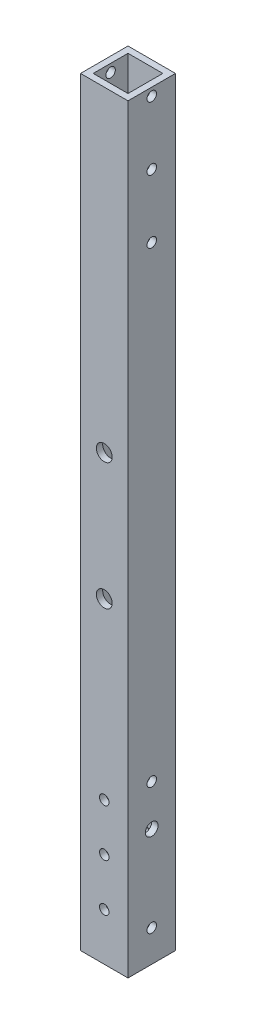
ISO-10303-21;
HEADER;
FILE_DESCRIPTION(('STEP AP214'),'2;1');
FILE_NAME('part.step','',(''),(''),'','','');
FILE_SCHEMA(('AUTOMOTIVE_DESIGN { 1 0 10303 214 1 1 1 1 }'));
ENDSEC;
DATA;
#1=APPLICATION_CONTEXT('core data for automotive mechanical design processes');
#2=APPLICATION_PROTOCOL_DEFINITION('international standard','automotive_design',2000,#1);
#3=PRODUCT_CONTEXT('',#1,'mechanical');
#4=PRODUCT('Part','Part','',(#3));
#5=PRODUCT_RELATED_PRODUCT_CATEGORY('part','',(#4));
#6=PRODUCT_DEFINITION_FORMATION('','',#4);
#7=PRODUCT_DEFINITION_CONTEXT('part definition',#1,'design');
#8=PRODUCT_DEFINITION('design','',#6,#7);
#9=PRODUCT_DEFINITION_SHAPE('','',#8);
#10=(LENGTH_UNIT() NAMED_UNIT(*) SI_UNIT(.MILLI.,.METRE.));
#11=(NAMED_UNIT(*) PLANE_ANGLE_UNIT() SI_UNIT($,.RADIAN.));
#12=(NAMED_UNIT(*) SI_UNIT($,.STERADIAN.) SOLID_ANGLE_UNIT());
#13=UNCERTAINTY_MEASURE_WITH_UNIT(LENGTH_MEASURE(1.E-05),#10,'distance_accuracy_value','');
#14=(GEOMETRIC_REPRESENTATION_CONTEXT(3) GLOBAL_UNCERTAINTY_ASSIGNED_CONTEXT((#13)) GLOBAL_UNIT_ASSIGNED_CONTEXT((#10,
#11,#12)) REPRESENTATION_CONTEXT('',''));
#15=CARTESIAN_POINT('',(0.,0.,0.));
#16=DIRECTION('',(0.,0.,1.));
#17=DIRECTION('',(1.,0.,0.));
#18=AXIS2_PLACEMENT_3D('',#15,#16,#17);
#19=CARTESIAN_POINT('',(7.49999999999999,240.,-7.5));
#20=DIRECTION('',(-1.,0.,0.));
#21=DIRECTION('',(0.,0.,1.));
#22=AXIS2_PLACEMENT_3D('',#19,#20,#21);
#23=PLANE('',#22);
#24=CARTESIAN_POINT('',(7.49999999999999,10.,0.));
#25=DIRECTION('',(-1.,0.,0.));
#26=DIRECTION('',(0.,0.,1.));
#27=AXIS2_PLACEMENT_3D('',#24,#25,#26);
#28=CIRCLE('',#27,1.5);
#29=CARTESIAN_POINT('',(7.49999999999999,10.,1.5));
#30=VERTEX_POINT('',#29);
#31=EDGE_CURVE('E195',#30,#30,#28,.T.);
#32=ORIENTED_EDGE('',*,*,#31,.T.);
#33=EDGE_LOOP('',(#32));
#34=FACE_BOUND('',#33,.T.);
#35=CARTESIAN_POINT('',(7.49999999999999,197.5,0.));
#36=DIRECTION('',(-1.,0.,0.));
#37=DIRECTION('',(0.,0.,1.));
#38=AXIS2_PLACEMENT_3D('',#35,#36,#37);
#39=CIRCLE('',#38,1.5);
#40=CARTESIAN_POINT('',(7.49999999999999,197.5,1.5));
#41=VERTEX_POINT('',#40);
#42=EDGE_CURVE('E297',#41,#41,#39,.T.);
#43=ORIENTED_EDGE('',*,*,#42,.T.);
#44=EDGE_LOOP('',(#43));
#45=FACE_BOUND('',#44,.T.);
#46=CARTESIAN_POINT('',(7.49999999999999,217.5,0.));
#47=DIRECTION('',(-1.,0.,0.));
#48=DIRECTION('',(0.,0.,1.));
#49=AXIS2_PLACEMENT_3D('',#46,#47,#48);
#50=CIRCLE('',#49,1.5);
#51=CARTESIAN_POINT('',(7.49999999999999,217.5,1.5));
#52=VERTEX_POINT('',#51);
#53=EDGE_CURVE('E301',#52,#52,#50,.T.);
#54=ORIENTED_EDGE('',*,*,#53,.T.);
#55=EDGE_LOOP('',(#54));
#56=FACE_BOUND('',#55,.T.);
#57=CARTESIAN_POINT('',(7.49999999999999,237.5,0.));
#58=DIRECTION('',(-1.,0.,0.));
#59=DIRECTION('',(0.,0.,1.));
#60=AXIS2_PLACEMENT_3D('',#57,#58,#59);
#61=CIRCLE('',#60,1.50000000000001);
#62=CARTESIAN_POINT('',(7.49999999999999,237.5,1.50000000000001));
#63=VERTEX_POINT('',#62);
#64=EDGE_CURVE('E305',#63,#63,#61,.T.);
#65=ORIENTED_EDGE('',*,*,#64,.T.);
#66=EDGE_LOOP('',(#65));
#67=FACE_BOUND('',#66,.T.);
#68=CARTESIAN_POINT('',(7.49999999999999,50.,0.));
#69=DIRECTION('',(-1.,0.,0.));
#70=DIRECTION('',(0.,0.,1.));
#71=AXIS2_PLACEMENT_3D('',#68,#69,#70);
#72=CIRCLE('',#71,1.5);
#73=CARTESIAN_POINT('',(7.49999999999999,50.,1.5));
#74=VERTEX_POINT('',#73);
#75=EDGE_CURVE('E309',#74,#74,#72,.T.);
#76=ORIENTED_EDGE('',*,*,#75,.T.);
#77=EDGE_LOOP('',(#76));
#78=FACE_BOUND('',#77,.T.);
#79=CARTESIAN_POINT('',(7.49999999999999,37.,0.));
#80=DIRECTION('',(-1.,0.,0.));
#81=DIRECTION('',(0.,0.,1.));
#82=AXIS2_PLACEMENT_3D('',#79,#80,#81);
#83=CIRCLE('',#82,2.);
#84=CARTESIAN_POINT('',(7.49999999999999,37.,2.));
#85=VERTEX_POINT('',#84);
#86=EDGE_CURVE('E313',#85,#85,#83,.T.);
#87=ORIENTED_EDGE('',*,*,#86,.T.);
#88=EDGE_LOOP('',(#87));
#89=FACE_BOUND('',#88,.T.);
#90=DIRECTION('',(0.,0.,-1.));
#91=VECTOR('',#90,1.);
#92=CARTESIAN_POINT('',(7.49999999999999,0.,-7.5));
#93=LINE('',#92,#91);
#94=CARTESIAN_POINT('',(7.49999999999999,0.,7.5));
#95=VERTEX_POINT('',#94);
#96=CARTESIAN_POINT('',(7.49999999999999,0.,-7.5));
#97=VERTEX_POINT('',#96);
#98=EDGE_CURVE('E141',#95,#97,#93,.T.);
#99=ORIENTED_EDGE('',*,*,#98,.T.);
#100=DIRECTION('',(0.,-1.,0.));
#101=VECTOR('',#100,1.);
#102=CARTESIAN_POINT('',(7.49999999999999,240.,-7.5));
#103=LINE('',#102,#101);
#104=CARTESIAN_POINT('',(7.49999999999999,240.,-7.5));
#105=VERTEX_POINT('',#104);
#106=EDGE_CURVE('E11',#105,#97,#103,.T.);
#107=ORIENTED_EDGE('',*,*,#106,.F.);
#108=DIRECTION('',(0.,0.,-1.));
#109=VECTOR('',#108,1.);
#110=CARTESIAN_POINT('',(7.49999999999999,240.,-7.5));
#111=LINE('',#110,#109);
#112=CARTESIAN_POINT('',(7.49999999999999,240.,7.5));
#113=VERTEX_POINT('',#112);
#114=EDGE_CURVE('E145',#113,#105,#111,.T.);
#115=ORIENTED_EDGE('',*,*,#114,.F.);
#116=DIRECTION('',(0.,-1.,0.));
#117=VECTOR('',#116,1.);
#118=CARTESIAN_POINT('',(7.49999999999999,240.,7.5));
#119=LINE('',#118,#117);
#120=EDGE_CURVE('E155',#113,#95,#119,.T.);
#121=ORIENTED_EDGE('',*,*,#120,.T.);
#122=EDGE_LOOP('',(#99,#107,#115,#121));
#123=FACE_BOUND('',#122,.T.);
#124=ADVANCED_FACE('F39',(#34,#45,#56,#67,#78,#89,#123),#23,.F.);
#125=CARTESIAN_POINT('',(-7.50000000000001,240.,-7.5));
#126=DIRECTION('',(0.,0.,1.));
#127=DIRECTION('',(1.,0.,0.));
#128=AXIS2_PLACEMENT_3D('',#125,#126,#127);
#129=PLANE('',#128);
#130=CARTESIAN_POINT('',(0.,45.,-7.5));
#131=DIRECTION('',(0.,0.,1.));
#132=DIRECTION('',(1.,0.,0.));
#133=AXIS2_PLACEMENT_3D('',#130,#131,#132);
#134=CIRCLE('',#133,1.5);
#135=CARTESIAN_POINT('',(1.5,45.,-7.5));
#136=VERTEX_POINT('',#135);
#137=EDGE_CURVE('E182',#136,#136,#134,.T.);
#138=ORIENTED_EDGE('',*,*,#137,.T.);
#139=EDGE_LOOP('',(#138));
#140=FACE_BOUND('',#139,.T.);
#141=CARTESIAN_POINT('',(0.,30.,-7.5));
#142=DIRECTION('',(0.,0.,1.));
#143=DIRECTION('',(1.,0.,0.));
#144=AXIS2_PLACEMENT_3D('',#141,#142,#143);
#145=CIRCLE('',#144,1.5);
#146=CARTESIAN_POINT('',(1.5,30.,-7.5));
#147=VERTEX_POINT('',#146);
#148=EDGE_CURVE('E230',#147,#147,#145,.T.);
#149=ORIENTED_EDGE('',*,*,#148,.T.);
#150=EDGE_LOOP('',(#149));
#151=FACE_BOUND('',#150,.T.);
#152=CARTESIAN_POINT('',(0.,15.,-7.5));
#153=DIRECTION('',(0.,0.,1.));
#154=DIRECTION('',(1.,0.,0.));
#155=AXIS2_PLACEMENT_3D('',#152,#153,#154);
#156=CIRCLE('',#155,1.5);
#157=CARTESIAN_POINT('',(1.5,15.,-7.5));
#158=VERTEX_POINT('',#157);
#159=EDGE_CURVE('E236',#158,#158,#156,.T.);
#160=ORIENTED_EDGE('',*,*,#159,.T.);
#161=EDGE_LOOP('',(#160));
#162=FACE_BOUND('',#161,.T.);
#163=CARTESIAN_POINT('',(0.,140.,-7.5));
#164=DIRECTION('',(0.,0.,1.));
#165=DIRECTION('',(1.,0.,0.));
#166=AXIS2_PLACEMENT_3D('',#163,#164,#165);
#167=CIRCLE('',#166,2.5);
#168=CARTESIAN_POINT('',(2.5,140.,-7.5));
#169=VERTEX_POINT('',#168);
#170=EDGE_CURVE('E174',#169,#169,#167,.T.);
#171=ORIENTED_EDGE('',*,*,#170,.T.);
#172=EDGE_LOOP('',(#171));
#173=FACE_BOUND('',#172,.T.);
#174=CARTESIAN_POINT('',(0.,100.,-7.5));
#175=DIRECTION('',(0.,0.,1.));
#176=DIRECTION('',(1.,0.,0.));
#177=AXIS2_PLACEMENT_3D('',#174,#175,#176);
#178=CIRCLE('',#177,2.5);
#179=CARTESIAN_POINT('',(2.5,100.,-7.5));
#180=VERTEX_POINT('',#179);
#181=EDGE_CURVE('E253',#180,#180,#178,.T.);
#182=ORIENTED_EDGE('',*,*,#181,.T.);
#183=EDGE_LOOP('',(#182));
#184=FACE_BOUND('',#183,.T.);
#185=DIRECTION('',(-1.,0.,0.));
#186=VECTOR('',#185,1.);
#187=CARTESIAN_POINT('',(-7.50000000000001,0.,-7.5));
#188=LINE('',#187,#186);
#189=CARTESIAN_POINT('',(-7.50000000000001,0.,-7.5));
#190=VERTEX_POINT('',#189);
#191=EDGE_CURVE('E158',#97,#190,#188,.T.);
#192=ORIENTED_EDGE('',*,*,#191,.T.);
#193=DIRECTION('',(0.,-1.,0.));
#194=VECTOR('',#193,1.);
#195=CARTESIAN_POINT('',(-7.50000000000001,240.,-7.5));
#196=LINE('',#195,#194);
#197=CARTESIAN_POINT('',(-7.50000000000001,240.,-7.5));
#198=VERTEX_POINT('',#197);
#199=EDGE_CURVE('E47',#198,#190,#196,.T.);
#200=ORIENTED_EDGE('',*,*,#199,.F.);
#201=DIRECTION('',(-1.,0.,0.));
#202=VECTOR('',#201,1.);
#203=CARTESIAN_POINT('',(-7.50000000000001,240.,-7.5));
#204=LINE('',#203,#202);
#205=EDGE_CURVE('E148',#105,#198,#204,.T.);
#206=ORIENTED_EDGE('',*,*,#205,.F.);
#207=ORIENTED_EDGE('',*,*,#106,.T.);
#208=EDGE_LOOP('',(#192,#200,#206,#207));
#209=FACE_BOUND('',#208,.T.);
#210=ADVANCED_FACE('F282',(#140,#151,#162,#173,#184,#209),#129,.F.);
#211=CARTESIAN_POINT('',(-7.50000000000001,240.,-7.5));
#212=DIRECTION('',(1.,0.,0.));
#213=DIRECTION('',(0.,0.,-1.));
#214=AXIS2_PLACEMENT_3D('',#211,#212,#213);
#215=PLANE('',#214);
#216=CARTESIAN_POINT('',(-7.50000000000001,10.,0.));
#217=DIRECTION('',(-1.,0.,0.));
#218=DIRECTION('',(0.,0.,1.));
#219=AXIS2_PLACEMENT_3D('',#216,#217,#218);
#220=CIRCLE('',#219,1.5);
#221=CARTESIAN_POINT('',(-7.50000000000001,10.,1.5));
#222=VERTEX_POINT('',#221);
#223=EDGE_CURVE('E454',#222,#222,#220,.T.);
#224=ORIENTED_EDGE('',*,*,#223,.F.);
#225=EDGE_LOOP('',(#224));
#226=FACE_BOUND('',#225,.T.);
#227=CARTESIAN_POINT('',(-7.50000000000001,197.5,0.));
#228=DIRECTION('',(-1.,0.,0.));
#229=DIRECTION('',(0.,0.,1.));
#230=AXIS2_PLACEMENT_3D('',#227,#228,#229);
#231=CIRCLE('',#230,1.5);
#232=CARTESIAN_POINT('',(-7.50000000000001,197.5,1.5));
#233=VERTEX_POINT('',#232);
#234=EDGE_CURVE('E504',#233,#233,#231,.T.);
#235=ORIENTED_EDGE('',*,*,#234,.F.);
#236=EDGE_LOOP('',(#235));
#237=FACE_BOUND('',#236,.T.);
#238=CARTESIAN_POINT('',(-7.50000000000001,217.5,0.));
#239=DIRECTION('',(-1.,0.,0.));
#240=DIRECTION('',(0.,0.,1.));
#241=AXIS2_PLACEMENT_3D('',#238,#239,#240);
#242=CIRCLE('',#241,1.5);
#243=CARTESIAN_POINT('',(-7.50000000000001,217.5,1.5));
#244=VERTEX_POINT('',#243);
#245=EDGE_CURVE('E491',#244,#244,#242,.T.);
#246=ORIENTED_EDGE('',*,*,#245,.F.);
#247=EDGE_LOOP('',(#246));
#248=FACE_BOUND('',#247,.T.);
#249=CARTESIAN_POINT('',(-7.50000000000001,237.5,0.));
#250=DIRECTION('',(-1.,0.,0.));
#251=DIRECTION('',(0.,0.,1.));
#252=AXIS2_PLACEMENT_3D('',#249,#250,#251);
#253=CIRCLE('',#252,1.50000000000001);
#254=CARTESIAN_POINT('',(-7.50000000000001,237.5,1.50000000000001));
#255=VERTEX_POINT('',#254);
#256=EDGE_CURVE('E487',#255,#255,#253,.T.);
#257=ORIENTED_EDGE('',*,*,#256,.F.);
#258=EDGE_LOOP('',(#257));
#259=FACE_BOUND('',#258,.T.);
#260=CARTESIAN_POINT('',(-7.50000000000001,50.,0.));
#261=DIRECTION('',(-1.,0.,0.));
#262=DIRECTION('',(0.,0.,1.));
#263=AXIS2_PLACEMENT_3D('',#260,#261,#262);
#264=CIRCLE('',#263,1.5);
#265=CARTESIAN_POINT('',(-7.50000000000001,50.,1.5));
#266=VERTEX_POINT('',#265);
#267=EDGE_CURVE('E480',#266,#266,#264,.T.);
#268=ORIENTED_EDGE('',*,*,#267,.F.);
#269=EDGE_LOOP('',(#268));
#270=FACE_BOUND('',#269,.T.);
#271=CARTESIAN_POINT('',(-7.50000000000001,37.,0.));
#272=DIRECTION('',(-1.,0.,0.));
#273=DIRECTION('',(0.,0.,1.));
#274=AXIS2_PLACEMENT_3D('',#271,#272,#273);
#275=CIRCLE('',#274,2.);
#276=CARTESIAN_POINT('',(-7.50000000000001,37.,2.));
#277=VERTEX_POINT('',#276);
#278=EDGE_CURVE('E476',#277,#277,#275,.T.);
#279=ORIENTED_EDGE('',*,*,#278,.F.);
#280=EDGE_LOOP('',(#279));
#281=FACE_BOUND('',#280,.T.);
#282=DIRECTION('',(0.,0.,1.));
#283=VECTOR('',#282,1.);
#284=CARTESIAN_POINT('',(-7.50000000000001,0.,-7.5));
#285=LINE('',#284,#283);
#286=CARTESIAN_POINT('',(-7.50000000000001,0.,7.5));
#287=VERTEX_POINT('',#286);
#288=EDGE_CURVE('E160',#190,#287,#285,.T.);
#289=ORIENTED_EDGE('',*,*,#288,.T.);
#290=DIRECTION('',(0.,-1.,0.));
#291=VECTOR('',#290,1.);
#292=CARTESIAN_POINT('',(-7.50000000000001,240.,7.5));
#293=LINE('',#292,#291);
#294=CARTESIAN_POINT('',(-7.50000000000001,240.,7.5));
#295=VERTEX_POINT('',#294);
#296=EDGE_CURVE('E165',#295,#287,#293,.T.);
#297=ORIENTED_EDGE('',*,*,#296,.F.);
#298=DIRECTION('',(0.,0.,1.));
#299=VECTOR('',#298,1.);
#300=CARTESIAN_POINT('',(-7.50000000000001,240.,-7.5));
#301=LINE('',#300,#299);
#302=EDGE_CURVE('E151',#198,#295,#301,.T.);
#303=ORIENTED_EDGE('',*,*,#302,.F.);
#304=ORIENTED_EDGE('',*,*,#199,.T.);
#305=EDGE_LOOP('',(#289,#297,#303,#304));
#306=FACE_BOUND('',#305,.T.);
#307=ADVANCED_FACE('F289',(#226,#237,#248,#259,#270,#281,#306),#215,.F.);
#308=CARTESIAN_POINT('',(-7.50000000000001,240.,7.5));
#309=DIRECTION('',(0.,0.,-1.));
#310=DIRECTION('',(-1.,0.,0.));
#311=AXIS2_PLACEMENT_3D('',#308,#309,#310);
#312=PLANE('',#311);
#313=CARTESIAN_POINT('',(0.,45.,7.5));
#314=DIRECTION('',(0.,0.,1.));
#315=DIRECTION('',(1.,0.,0.));
#316=AXIS2_PLACEMENT_3D('',#313,#314,#315);
#317=CIRCLE('',#316,1.5);
#318=CARTESIAN_POINT('',(1.5,45.,7.5));
#319=VERTEX_POINT('',#318);
#320=EDGE_CURVE('E227',#319,#319,#317,.T.);
#321=ORIENTED_EDGE('',*,*,#320,.F.);
#322=EDGE_LOOP('',(#321));
#323=FACE_BOUND('',#322,.T.);
#324=CARTESIAN_POINT('',(0.,30.,7.5));
#325=DIRECTION('',(0.,0.,1.));
#326=DIRECTION('',(1.,0.,0.));
#327=AXIS2_PLACEMENT_3D('',#324,#325,#326);
#328=CIRCLE('',#327,1.5);
#329=CARTESIAN_POINT('',(1.5,30.,7.5));
#330=VERTEX_POINT('',#329);
#331=EDGE_CURVE('E233',#330,#330,#328,.T.);
#332=ORIENTED_EDGE('',*,*,#331,.F.);
#333=EDGE_LOOP('',(#332));
#334=FACE_BOUND('',#333,.T.);
#335=CARTESIAN_POINT('',(0.,15.,7.5));
#336=DIRECTION('',(0.,0.,1.));
#337=DIRECTION('',(1.,0.,0.));
#338=AXIS2_PLACEMENT_3D('',#335,#336,#337);
#339=CIRCLE('',#338,1.5);
#340=CARTESIAN_POINT('',(1.5,15.,7.5));
#341=VERTEX_POINT('',#340);
#342=EDGE_CURVE('E224',#341,#341,#339,.T.);
#343=ORIENTED_EDGE('',*,*,#342,.F.);
#344=EDGE_LOOP('',(#343));
#345=FACE_BOUND('',#344,.T.);
#346=CARTESIAN_POINT('',(0.,140.,7.5));
#347=DIRECTION('',(0.,0.,1.));
#348=DIRECTION('',(1.,0.,0.));
#349=AXIS2_PLACEMENT_3D('',#346,#347,#348);
#350=CIRCLE('',#349,2.5);
#351=CARTESIAN_POINT('',(2.5,140.,7.5));
#352=VERTEX_POINT('',#351);
#353=EDGE_CURVE('E250',#352,#352,#350,.T.);
#354=ORIENTED_EDGE('',*,*,#353,.F.);
#355=EDGE_LOOP('',(#354));
#356=FACE_BOUND('',#355,.T.);
#357=CARTESIAN_POINT('',(0.,100.,7.5));
#358=DIRECTION('',(0.,0.,1.));
#359=DIRECTION('',(1.,0.,0.));
#360=AXIS2_PLACEMENT_3D('',#357,#358,#359);
#361=CIRCLE('',#360,2.5);
#362=CARTESIAN_POINT('',(2.5,100.,7.5));
#363=VERTEX_POINT('',#362);
#364=EDGE_CURVE('E247',#363,#363,#361,.T.);
#365=ORIENTED_EDGE('',*,*,#364,.F.);
#366=EDGE_LOOP('',(#365));
#367=FACE_BOUND('',#366,.T.);
#368=DIRECTION('',(1.,0.,0.));
#369=VECTOR('',#368,1.);
#370=CARTESIAN_POINT('',(-7.50000000000001,0.,7.5));
#371=LINE('',#370,#369);
#372=EDGE_CURVE('E149',#287,#95,#371,.T.);
#373=ORIENTED_EDGE('',*,*,#372,.T.);
#374=ORIENTED_EDGE('',*,*,#120,.F.);
#375=DIRECTION('',(1.,0.,0.));
#376=VECTOR('',#375,1.);
#377=CARTESIAN_POINT('',(-7.50000000000001,240.,7.5));
#378=LINE('',#377,#376);
#379=EDGE_CURVE('E153',#295,#113,#378,.T.);
#380=ORIENTED_EDGE('',*,*,#379,.F.);
#381=ORIENTED_EDGE('',*,*,#296,.T.);
#382=EDGE_LOOP('',(#373,#374,#380,#381));
#383=FACE_BOUND('',#382,.T.);
#384=ADVANCED_FACE('F328',(#323,#334,#345,#356,#367,#383),#312,.F.);
#385=CARTESIAN_POINT('',(0.,240.,0.));
#386=DIRECTION('',(0.,1.,0.));
#387=DIRECTION('',(0.,0.,1.));
#388=AXIS2_PLACEMENT_3D('',#385,#386,#387);
#389=PLANE('',#388);
#390=DIRECTION('',(0.,0.,-1.));
#391=VECTOR('',#390,1.);
#392=CARTESIAN_POINT('',(5.5,240.,-5.5));
#393=LINE('',#392,#391);
#394=CARTESIAN_POINT('',(5.5,240.,5.5));
#395=VERTEX_POINT('',#394);
#396=CARTESIAN_POINT('',(5.5,240.,-5.5));
#397=VERTEX_POINT('',#396);
#398=EDGE_CURVE('E55',#395,#397,#393,.T.);
#399=ORIENTED_EDGE('',*,*,#398,.F.);
#400=DIRECTION('',(1.,0.,0.));
#401=VECTOR('',#400,1.);
#402=CARTESIAN_POINT('',(-5.5,240.,5.5));
#403=LINE('',#402,#401);
#404=CARTESIAN_POINT('',(-5.5,240.,5.5));
#405=VERTEX_POINT('',#404);
#406=EDGE_CURVE('E123',#405,#395,#403,.T.);
#407=ORIENTED_EDGE('',*,*,#406,.F.);
#408=DIRECTION('',(0.,0.,1.));
#409=VECTOR('',#408,1.);
#410=CARTESIAN_POINT('',(-5.5,240.,-5.5));
#411=LINE('',#410,#409);
#412=CARTESIAN_POINT('',(-5.5,240.,-5.5));
#413=VERTEX_POINT('',#412);
#414=EDGE_CURVE('E126',#413,#405,#411,.T.);
#415=ORIENTED_EDGE('',*,*,#414,.F.);
#416=DIRECTION('',(-1.,0.,0.));
#417=VECTOR('',#416,1.);
#418=CARTESIAN_POINT('',(-5.5,240.,-5.5));
#419=LINE('',#418,#417);
#420=EDGE_CURVE('E135',#397,#413,#419,.T.);
#421=ORIENTED_EDGE('',*,*,#420,.F.);
#422=EDGE_LOOP('',(#399,#407,#415,#421));
#423=FACE_BOUND('',#422,.T.);
#424=ORIENTED_EDGE('',*,*,#114,.T.);
#425=ORIENTED_EDGE('',*,*,#205,.T.);
#426=ORIENTED_EDGE('',*,*,#302,.T.);
#427=ORIENTED_EDGE('',*,*,#379,.T.);
#428=EDGE_LOOP('',(#424,#425,#426,#427));
#429=FACE_BOUND('',#428,.T.);
#430=ADVANCED_FACE('F324',(#423,#429),#389,.T.);
#431=CARTESIAN_POINT('',(0.,0.,0.));
#432=DIRECTION('',(0.,1.,0.));
#433=DIRECTION('',(0.,0.,1.));
#434=AXIS2_PLACEMENT_3D('',#431,#432,#433);
#435=PLANE('',#434);
#436=DIRECTION('',(1.,0.,0.));
#437=VECTOR('',#436,1.);
#438=CARTESIAN_POINT('',(-5.5,0.,5.5));
#439=LINE('',#438,#437);
#440=CARTESIAN_POINT('',(-5.5,0.,5.5));
#441=VERTEX_POINT('',#440);
#442=CARTESIAN_POINT('',(5.5,0.,5.5));
#443=VERTEX_POINT('',#442);
#444=EDGE_CURVE('E113',#441,#443,#439,.T.);
#445=ORIENTED_EDGE('',*,*,#444,.T.);
#446=DIRECTION('',(0.,0.,-1.));
#447=VECTOR('',#446,1.);
#448=CARTESIAN_POINT('',(5.5,0.,-5.5));
#449=LINE('',#448,#447);
#450=CARTESIAN_POINT('',(5.5,0.,-5.5));
#451=VERTEX_POINT('',#450);
#452=EDGE_CURVE('E107',#443,#451,#449,.T.);
#453=ORIENTED_EDGE('',*,*,#452,.T.);
#454=DIRECTION('',(-1.,0.,0.));
#455=VECTOR('',#454,1.);
#456=CARTESIAN_POINT('',(-5.5,0.,-5.5));
#457=LINE('',#456,#455);
#458=CARTESIAN_POINT('',(-5.5,0.,-5.5));
#459=VERTEX_POINT('',#458);
#460=EDGE_CURVE('E116',#451,#459,#457,.T.);
#461=ORIENTED_EDGE('',*,*,#460,.T.);
#462=DIRECTION('',(0.,0.,1.));
#463=VECTOR('',#462,1.);
#464=CARTESIAN_POINT('',(-5.5,0.,-5.5));
#465=LINE('',#464,#463);
#466=EDGE_CURVE('E63',#459,#441,#465,.T.);
#467=ORIENTED_EDGE('',*,*,#466,.T.);
#468=EDGE_LOOP('',(#445,#453,#461,#467));
#469=FACE_BOUND('',#468,.T.);
#470=ORIENTED_EDGE('',*,*,#98,.F.);
#471=ORIENTED_EDGE('',*,*,#372,.F.);
#472=ORIENTED_EDGE('',*,*,#288,.F.);
#473=ORIENTED_EDGE('',*,*,#191,.F.);
#474=EDGE_LOOP('',(#470,#471,#472,#473));
#475=FACE_BOUND('',#474,.T.);
#476=ADVANCED_FACE('F120',(#469,#475),#435,.F.);
#477=CARTESIAN_POINT('',(5.5,0.,-5.5));
#478=DIRECTION('',(1.,0.,0.));
#479=DIRECTION('',(0.,0.,-1.));
#480=AXIS2_PLACEMENT_3D('',#477,#478,#479);
#481=PLANE('',#480);
#482=CARTESIAN_POINT('',(5.5,10.,0.));
#483=DIRECTION('',(1.,0.,0.));
#484=DIRECTION('',(0.,0.,-1.));
#485=AXIS2_PLACEMENT_3D('',#482,#483,#484);
#486=CIRCLE('',#485,1.5);
#487=CARTESIAN_POINT('',(5.5,10.,-1.5));
#488=VERTEX_POINT('',#487);
#489=EDGE_CURVE('E221',#488,#488,#486,.T.);
#490=ORIENTED_EDGE('',*,*,#489,.T.);
#491=EDGE_LOOP('',(#490));
#492=FACE_BOUND('',#491,.T.);
#493=CARTESIAN_POINT('',(5.5,197.5,0.));
#494=DIRECTION('',(1.,0.,0.));
#495=DIRECTION('',(0.,0.,-1.));
#496=AXIS2_PLACEMENT_3D('',#493,#494,#495);
#497=CIRCLE('',#496,1.5);
#498=CARTESIAN_POINT('',(5.5,197.5,-1.5));
#499=VERTEX_POINT('',#498);
#500=EDGE_CURVE('E209',#499,#499,#497,.T.);
#501=ORIENTED_EDGE('',*,*,#500,.T.);
#502=EDGE_LOOP('',(#501));
#503=FACE_BOUND('',#502,.T.);
#504=CARTESIAN_POINT('',(5.5,217.5,0.));
#505=DIRECTION('',(1.,0.,0.));
#506=DIRECTION('',(0.,0.,-1.));
#507=AXIS2_PLACEMENT_3D('',#504,#505,#506);
#508=CIRCLE('',#507,1.5);
#509=CARTESIAN_POINT('',(5.5,217.5,-1.5));
#510=VERTEX_POINT('',#509);
#511=EDGE_CURVE('E206',#510,#510,#508,.T.);
#512=ORIENTED_EDGE('',*,*,#511,.T.);
#513=EDGE_LOOP('',(#512));
#514=FACE_BOUND('',#513,.T.);
#515=CARTESIAN_POINT('',(5.5,237.5,0.));
#516=DIRECTION('',(1.,0.,0.));
#517=DIRECTION('',(0.,0.,-1.));
#518=AXIS2_PLACEMENT_3D('',#515,#516,#517);
#519=CIRCLE('',#518,1.50000000000001);
#520=CARTESIAN_POINT('',(5.5,237.5,-1.50000000000001));
#521=VERTEX_POINT('',#520);
#522=EDGE_CURVE('E203',#521,#521,#519,.T.);
#523=ORIENTED_EDGE('',*,*,#522,.T.);
#524=EDGE_LOOP('',(#523));
#525=FACE_BOUND('',#524,.T.);
#526=CARTESIAN_POINT('',(5.5,50.,0.));
#527=DIRECTION('',(1.,0.,0.));
#528=DIRECTION('',(0.,0.,-1.));
#529=AXIS2_PLACEMENT_3D('',#526,#527,#528);
#530=CIRCLE('',#529,1.5);
#531=CARTESIAN_POINT('',(5.5,50.,-1.5));
#532=VERTEX_POINT('',#531);
#533=EDGE_CURVE('E199',#532,#532,#530,.T.);
#534=ORIENTED_EDGE('',*,*,#533,.T.);
#535=EDGE_LOOP('',(#534));
#536=FACE_BOUND('',#535,.T.);
#537=CARTESIAN_POINT('',(5.5,37.,0.));
#538=DIRECTION('',(1.,0.,0.));
#539=DIRECTION('',(0.,0.,-1.));
#540=AXIS2_PLACEMENT_3D('',#537,#538,#539);
#541=CIRCLE('',#540,2.);
#542=CARTESIAN_POINT('',(5.5,37.,-2.));
#543=VERTEX_POINT('',#542);
#544=EDGE_CURVE('E194',#543,#543,#541,.T.);
#545=ORIENTED_EDGE('',*,*,#544,.T.);
#546=EDGE_LOOP('',(#545));
#547=FACE_BOUND('',#546,.T.);
#548=ORIENTED_EDGE('',*,*,#398,.T.);
#549=DIRECTION('',(0.,1.,0.));
#550=VECTOR('',#549,1.);
#551=CARTESIAN_POINT('',(5.5,0.,-5.5));
#552=LINE('',#551,#550);
#553=EDGE_CURVE('E103',#451,#397,#552,.T.);
#554=ORIENTED_EDGE('',*,*,#553,.F.);
#555=ORIENTED_EDGE('',*,*,#452,.F.);
#556=DIRECTION('',(0.,1.,0.));
#557=VECTOR('',#556,1.);
#558=CARTESIAN_POINT('',(5.5,0.,5.5));
#559=LINE('',#558,#557);
#560=EDGE_CURVE('E139',#443,#395,#559,.T.);
#561=ORIENTED_EDGE('',*,*,#560,.T.);
#562=EDGE_LOOP('',(#548,#554,#555,#561));
#563=FACE_BOUND('',#562,.T.);
#564=ADVANCED_FACE('F105',(#492,#503,#514,#525,#536,#547,#563),#481,.F.);
#565=CARTESIAN_POINT('',(-5.5,0.,5.5));
#566=DIRECTION('',(0.,0.,1.));
#567=DIRECTION('',(1.,0.,0.));
#568=AXIS2_PLACEMENT_3D('',#565,#566,#567);
#569=PLANE('',#568);
#570=CARTESIAN_POINT('',(0.,45.,5.5));
#571=DIRECTION('',(0.,0.,1.));
#572=DIRECTION('',(1.,0.,0.));
#573=AXIS2_PLACEMENT_3D('',#570,#571,#572);
#574=CIRCLE('',#573,1.5);
#575=CARTESIAN_POINT('',(1.5,45.,5.5));
#576=VERTEX_POINT('',#575);
#577=EDGE_CURVE('E190',#576,#576,#574,.T.);
#578=ORIENTED_EDGE('',*,*,#577,.T.);
#579=EDGE_LOOP('',(#578));
#580=FACE_BOUND('',#579,.T.);
#581=CARTESIAN_POINT('',(0.,30.,5.5));
#582=DIRECTION('',(0.,0.,1.));
#583=DIRECTION('',(1.,0.,0.));
#584=AXIS2_PLACEMENT_3D('',#581,#582,#583);
#585=CIRCLE('',#584,1.5);
#586=CARTESIAN_POINT('',(1.5,30.,5.5));
#587=VERTEX_POINT('',#586);
#588=EDGE_CURVE('E186',#587,#587,#585,.T.);
#589=ORIENTED_EDGE('',*,*,#588,.T.);
#590=EDGE_LOOP('',(#589));
#591=FACE_BOUND('',#590,.T.);
#592=CARTESIAN_POINT('',(0.,15.,5.5));
#593=DIRECTION('',(0.,0.,1.));
#594=DIRECTION('',(1.,0.,0.));
#595=AXIS2_PLACEMENT_3D('',#592,#593,#594);
#596=CIRCLE('',#595,1.5);
#597=CARTESIAN_POINT('',(1.5,15.,5.5));
#598=VERTEX_POINT('',#597);
#599=EDGE_CURVE('E181',#598,#598,#596,.T.);
#600=ORIENTED_EDGE('',*,*,#599,.T.);
#601=EDGE_LOOP('',(#600));
#602=FACE_BOUND('',#601,.T.);
#603=CARTESIAN_POINT('',(0.,140.,5.5));
#604=DIRECTION('',(0.,0.,1.));
#605=DIRECTION('',(1.,0.,0.));
#606=AXIS2_PLACEMENT_3D('',#603,#604,#605);
#607=CIRCLE('',#606,2.5);
#608=CARTESIAN_POINT('',(2.5,140.,5.5));
#609=VERTEX_POINT('',#608);
#610=EDGE_CURVE('E129',#609,#609,#607,.T.);
#611=ORIENTED_EDGE('',*,*,#610,.T.);
#612=EDGE_LOOP('',(#611));
#613=FACE_BOUND('',#612,.T.);
#614=CARTESIAN_POINT('',(0.,100.,5.5));
#615=DIRECTION('',(0.,0.,1.));
#616=DIRECTION('',(1.,0.,0.));
#617=AXIS2_PLACEMENT_3D('',#614,#615,#616);
#618=CIRCLE('',#617,2.5);
#619=CARTESIAN_POINT('',(2.5,100.,5.5));
#620=VERTEX_POINT('',#619);
#621=EDGE_CURVE('E173',#620,#620,#618,.T.);
#622=ORIENTED_EDGE('',*,*,#621,.T.);
#623=EDGE_LOOP('',(#622));
#624=FACE_BOUND('',#623,.T.);
#625=ORIENTED_EDGE('',*,*,#406,.T.);
#626=ORIENTED_EDGE('',*,*,#560,.F.);
#627=ORIENTED_EDGE('',*,*,#444,.F.);
#628=DIRECTION('',(0.,1.,0.));
#629=VECTOR('',#628,1.);
#630=CARTESIAN_POINT('',(-5.5,0.,5.5));
#631=LINE('',#630,#629);
#632=EDGE_CURVE('E142',#441,#405,#631,.T.);
#633=ORIENTED_EDGE('',*,*,#632,.T.);
#634=EDGE_LOOP('',(#625,#626,#627,#633));
#635=FACE_BOUND('',#634,.T.);
#636=ADVANCED_FACE('F260',(#580,#591,#602,#613,#624,#635),#569,.F.);
#637=CARTESIAN_POINT('',(-5.5,0.,-5.5));
#638=DIRECTION('',(-1.,0.,0.));
#639=DIRECTION('',(0.,0.,1.));
#640=AXIS2_PLACEMENT_3D('',#637,#638,#639);
#641=PLANE('',#640);
#642=CARTESIAN_POINT('',(-5.5,10.,0.));
#643=DIRECTION('',(-1.,0.,0.));
#644=DIRECTION('',(0.,0.,1.));
#645=AXIS2_PLACEMENT_3D('',#642,#643,#644);
#646=CIRCLE('',#645,1.5);
#647=CARTESIAN_POINT('',(-5.5,10.,1.5));
#648=VERTEX_POINT('',#647);
#649=EDGE_CURVE('E42',#648,#648,#646,.T.);
#650=ORIENTED_EDGE('',*,*,#649,.T.);
#651=EDGE_LOOP('',(#650));
#652=FACE_BOUND('',#651,.T.);
#653=CARTESIAN_POINT('',(-5.5,197.5,0.));
#654=DIRECTION('',(-1.,0.,0.));
#655=DIRECTION('',(0.,0.,1.));
#656=AXIS2_PLACEMENT_3D('',#653,#654,#655);
#657=CIRCLE('',#656,1.5);
#658=CARTESIAN_POINT('',(-5.5,197.5,1.5));
#659=VERTEX_POINT('',#658);
#660=EDGE_CURVE('E207',#659,#659,#657,.T.);
#661=ORIENTED_EDGE('',*,*,#660,.T.);
#662=EDGE_LOOP('',(#661));
#663=FACE_BOUND('',#662,.T.);
#664=CARTESIAN_POINT('',(-5.5,217.5,0.));
#665=DIRECTION('',(-1.,0.,0.));
#666=DIRECTION('',(0.,0.,1.));
#667=AXIS2_PLACEMENT_3D('',#664,#665,#666);
#668=CIRCLE('',#667,1.5);
#669=CARTESIAN_POINT('',(-5.5,217.5,1.5));
#670=VERTEX_POINT('',#669);
#671=EDGE_CURVE('E204',#670,#670,#668,.T.);
#672=ORIENTED_EDGE('',*,*,#671,.T.);
#673=EDGE_LOOP('',(#672));
#674=FACE_BOUND('',#673,.T.);
#675=CARTESIAN_POINT('',(-5.5,237.5,0.));
#676=DIRECTION('',(-1.,0.,0.));
#677=DIRECTION('',(0.,0.,1.));
#678=AXIS2_PLACEMENT_3D('',#675,#676,#677);
#679=CIRCLE('',#678,1.50000000000001);
#680=CARTESIAN_POINT('',(-5.5,237.5,1.50000000000001));
#681=VERTEX_POINT('',#680);
#682=EDGE_CURVE('E200',#681,#681,#679,.T.);
#683=ORIENTED_EDGE('',*,*,#682,.T.);
#684=EDGE_LOOP('',(#683));
#685=FACE_BOUND('',#684,.T.);
#686=CARTESIAN_POINT('',(-5.5,50.,0.));
#687=DIRECTION('',(-1.,0.,0.));
#688=DIRECTION('',(0.,0.,1.));
#689=AXIS2_PLACEMENT_3D('',#686,#687,#688);
#690=CIRCLE('',#689,1.5);
#691=CARTESIAN_POINT('',(-5.5,50.,1.5));
#692=VERTEX_POINT('',#691);
#693=EDGE_CURVE('E196',#692,#692,#690,.T.);
#694=ORIENTED_EDGE('',*,*,#693,.T.);
#695=EDGE_LOOP('',(#694));
#696=FACE_BOUND('',#695,.T.);
#697=CARTESIAN_POINT('',(-5.5,37.,0.));
#698=DIRECTION('',(-1.,0.,0.));
#699=DIRECTION('',(0.,0.,1.));
#700=AXIS2_PLACEMENT_3D('',#697,#698,#699);
#701=CIRCLE('',#700,2.);
#702=CARTESIAN_POINT('',(-5.5,37.,2.));
#703=VERTEX_POINT('',#702);
#704=EDGE_CURVE('E191',#703,#703,#701,.T.);
#705=ORIENTED_EDGE('',*,*,#704,.T.);
#706=EDGE_LOOP('',(#705));
#707=FACE_BOUND('',#706,.T.);
#708=ORIENTED_EDGE('',*,*,#414,.T.);
#709=ORIENTED_EDGE('',*,*,#632,.F.);
#710=ORIENTED_EDGE('',*,*,#466,.F.);
#711=DIRECTION('',(0.,1.,0.));
#712=VECTOR('',#711,1.);
#713=CARTESIAN_POINT('',(-5.5,0.,-5.5));
#714=LINE('',#713,#712);
#715=EDGE_CURVE('E112',#459,#413,#714,.T.);
#716=ORIENTED_EDGE('',*,*,#715,.T.);
#717=EDGE_LOOP('',(#708,#709,#710,#716));
#718=FACE_BOUND('',#717,.T.);
#719=ADVANCED_FACE('F350',(#652,#663,#674,#685,#696,#707,#718),#641,.F.);
#720=CARTESIAN_POINT('',(-5.5,0.,-5.5));
#721=DIRECTION('',(0.,0.,-1.));
#722=DIRECTION('',(-1.,0.,0.));
#723=AXIS2_PLACEMENT_3D('',#720,#721,#722);
#724=PLANE('',#723);
#725=CARTESIAN_POINT('',(0.,45.,-5.5));
#726=DIRECTION('',(0.,0.,-1.));
#727=DIRECTION('',(-1.,0.,0.));
#728=AXIS2_PLACEMENT_3D('',#725,#726,#727);
#729=CIRCLE('',#728,1.5);
#730=CARTESIAN_POINT('',(-1.5,45.,-5.5));
#731=VERTEX_POINT('',#730);
#732=EDGE_CURVE('E187',#731,#731,#729,.T.);
#733=ORIENTED_EDGE('',*,*,#732,.T.);
#734=EDGE_LOOP('',(#733));
#735=FACE_BOUND('',#734,.T.);
#736=CARTESIAN_POINT('',(0.,30.,-5.5));
#737=DIRECTION('',(0.,0.,-1.));
#738=DIRECTION('',(-1.,0.,0.));
#739=AXIS2_PLACEMENT_3D('',#736,#737,#738);
#740=CIRCLE('',#739,1.5);
#741=CARTESIAN_POINT('',(-1.5,30.,-5.5));
#742=VERTEX_POINT('',#741);
#743=EDGE_CURVE('E183',#742,#742,#740,.T.);
#744=ORIENTED_EDGE('',*,*,#743,.T.);
#745=EDGE_LOOP('',(#744));
#746=FACE_BOUND('',#745,.T.);
#747=CARTESIAN_POINT('',(0.,15.,-5.5));
#748=DIRECTION('',(0.,0.,-1.));
#749=DIRECTION('',(-1.,0.,0.));
#750=AXIS2_PLACEMENT_3D('',#747,#748,#749);
#751=CIRCLE('',#750,1.5);
#752=CARTESIAN_POINT('',(-1.5,15.,-5.5));
#753=VERTEX_POINT('',#752);
#754=EDGE_CURVE('E178',#753,#753,#751,.T.);
#755=ORIENTED_EDGE('',*,*,#754,.T.);
#756=EDGE_LOOP('',(#755));
#757=FACE_BOUND('',#756,.T.);
#758=CARTESIAN_POINT('',(0.,140.,-5.5));
#759=DIRECTION('',(0.,0.,-1.));
#760=DIRECTION('',(-1.,0.,0.));
#761=AXIS2_PLACEMENT_3D('',#758,#759,#760);
#762=CIRCLE('',#761,2.5);
#763=CARTESIAN_POINT('',(-2.5,140.,-5.5));
#764=VERTEX_POINT('',#763);
#765=EDGE_CURVE('E175',#764,#764,#762,.T.);
#766=ORIENTED_EDGE('',*,*,#765,.T.);
#767=EDGE_LOOP('',(#766));
#768=FACE_BOUND('',#767,.T.);
#769=CARTESIAN_POINT('',(0.,100.,-5.5));
#770=DIRECTION('',(0.,0.,-1.));
#771=DIRECTION('',(-1.,0.,0.));
#772=AXIS2_PLACEMENT_3D('',#769,#770,#771);
#773=CIRCLE('',#772,2.5);
#774=CARTESIAN_POINT('',(-2.5,100.,-5.5));
#775=VERTEX_POINT('',#774);
#776=EDGE_CURVE('E170',#775,#775,#773,.T.);
#777=ORIENTED_EDGE('',*,*,#776,.T.);
#778=EDGE_LOOP('',(#777));
#779=FACE_BOUND('',#778,.T.);
#780=ORIENTED_EDGE('',*,*,#420,.T.);
#781=ORIENTED_EDGE('',*,*,#715,.F.);
#782=ORIENTED_EDGE('',*,*,#460,.F.);
#783=ORIENTED_EDGE('',*,*,#553,.T.);
#784=EDGE_LOOP('',(#780,#781,#782,#783));
#785=FACE_BOUND('',#784,.T.);
#786=ADVANCED_FACE('F117',(#735,#746,#757,#768,#779,#785),#724,.F.);
#787=CARTESIAN_POINT('',(0.,100.,-7.5));
#788=DIRECTION('',(0.,0.,1.));
#789=DIRECTION('',(1.,0.,0.));
#790=AXIS2_PLACEMENT_3D('',#787,#788,#789);
#791=CYLINDRICAL_SURFACE('',#790,2.5);
#792=ORIENTED_EDGE('',*,*,#181,.F.);
#793=EDGE_LOOP('',(#792));
#794=FACE_BOUND('',#793,.T.);
#795=ORIENTED_EDGE('',*,*,#776,.F.);
#796=EDGE_LOOP('',(#795));
#797=FACE_BOUND('',#796,.T.);
#798=ADVANCED_FACE('F269',(#794,#797),#791,.F.);
#799=CARTESIAN_POINT('',(0.,140.,-7.5));
#800=DIRECTION('',(0.,0.,1.));
#801=DIRECTION('',(1.,0.,0.));
#802=AXIS2_PLACEMENT_3D('',#799,#800,#801);
#803=CYLINDRICAL_SURFACE('',#802,2.5);
#804=ORIENTED_EDGE('',*,*,#170,.F.);
#805=EDGE_LOOP('',(#804));
#806=FACE_BOUND('',#805,.T.);
#807=ORIENTED_EDGE('',*,*,#765,.F.);
#808=EDGE_LOOP('',(#807));
#809=FACE_BOUND('',#808,.T.);
#810=ADVANCED_FACE('F266',(#806,#809),#803,.F.);
#811=ORIENTED_EDGE('',*,*,#364,.T.);
#812=EDGE_LOOP('',(#811));
#813=FACE_BOUND('',#812,.T.);
#814=ORIENTED_EDGE('',*,*,#621,.F.);
#815=EDGE_LOOP('',(#814));
#816=FACE_BOUND('',#815,.T.);
#817=ADVANCED_FACE('F263',(#813,#816),#791,.F.);
#818=ORIENTED_EDGE('',*,*,#353,.T.);
#819=EDGE_LOOP('',(#818));
#820=FACE_BOUND('',#819,.T.);
#821=ORIENTED_EDGE('',*,*,#610,.F.);
#822=EDGE_LOOP('',(#821));
#823=FACE_BOUND('',#822,.T.);
#824=ADVANCED_FACE('F265',(#820,#823),#803,.F.);
#825=CARTESIAN_POINT('',(0.,15.,-7.5));
#826=DIRECTION('',(0.,0.,1.));
#827=DIRECTION('',(1.,0.,0.));
#828=AXIS2_PLACEMENT_3D('',#825,#826,#827);
#829=CYLINDRICAL_SURFACE('',#828,1.5);
#830=ORIENTED_EDGE('',*,*,#159,.F.);
#831=EDGE_LOOP('',(#830));
#832=FACE_BOUND('',#831,.T.);
#833=ORIENTED_EDGE('',*,*,#754,.F.);
#834=EDGE_LOOP('',(#833));
#835=FACE_BOUND('',#834,.T.);
#836=ADVANCED_FACE('F274',(#832,#835),#829,.F.);
#837=CARTESIAN_POINT('',(0.,30.,-7.5));
#838=DIRECTION('',(0.,0.,1.));
#839=DIRECTION('',(1.,0.,0.));
#840=AXIS2_PLACEMENT_3D('',#837,#838,#839);
#841=CYLINDRICAL_SURFACE('',#840,1.5);
#842=ORIENTED_EDGE('',*,*,#148,.F.);
#843=EDGE_LOOP('',(#842));
#844=FACE_BOUND('',#843,.T.);
#845=ORIENTED_EDGE('',*,*,#743,.F.);
#846=EDGE_LOOP('',(#845));
#847=FACE_BOUND('',#846,.T.);
#848=ADVANCED_FACE('F383',(#844,#847),#841,.F.);
#849=CARTESIAN_POINT('',(0.,45.,-7.5));
#850=DIRECTION('',(0.,0.,1.));
#851=DIRECTION('',(1.,0.,0.));
#852=AXIS2_PLACEMENT_3D('',#849,#850,#851);
#853=CYLINDRICAL_SURFACE('',#852,1.5);
#854=ORIENTED_EDGE('',*,*,#137,.F.);
#855=EDGE_LOOP('',(#854));
#856=FACE_BOUND('',#855,.T.);
#857=ORIENTED_EDGE('',*,*,#732,.F.);
#858=EDGE_LOOP('',(#857));
#859=FACE_BOUND('',#858,.T.);
#860=ADVANCED_FACE('F373',(#856,#859),#853,.F.);
#861=ORIENTED_EDGE('',*,*,#342,.T.);
#862=EDGE_LOOP('',(#861));
#863=FACE_BOUND('',#862,.T.);
#864=ORIENTED_EDGE('',*,*,#599,.F.);
#865=EDGE_LOOP('',(#864));
#866=FACE_BOUND('',#865,.T.);
#867=ADVANCED_FACE('F370',(#863,#866),#829,.F.);
#868=ORIENTED_EDGE('',*,*,#331,.T.);
#869=EDGE_LOOP('',(#868));
#870=FACE_BOUND('',#869,.T.);
#871=ORIENTED_EDGE('',*,*,#588,.F.);
#872=EDGE_LOOP('',(#871));
#873=FACE_BOUND('',#872,.T.);
#874=ADVANCED_FACE('F372',(#870,#873),#841,.F.);
#875=ORIENTED_EDGE('',*,*,#320,.T.);
#876=EDGE_LOOP('',(#875));
#877=FACE_BOUND('',#876,.T.);
#878=ORIENTED_EDGE('',*,*,#577,.F.);
#879=EDGE_LOOP('',(#878));
#880=FACE_BOUND('',#879,.T.);
#881=ADVANCED_FACE('F380',(#877,#880),#853,.F.);
#882=CARTESIAN_POINT('',(7.49999999999999,37.,0.));
#883=DIRECTION('',(-1.,0.,0.));
#884=DIRECTION('',(0.,0.,1.));
#885=AXIS2_PLACEMENT_3D('',#882,#883,#884);
#886=CYLINDRICAL_SURFACE('',#885,2.);
#887=ORIENTED_EDGE('',*,*,#278,.T.);
#888=EDGE_LOOP('',(#887));
#889=FACE_BOUND('',#888,.T.);
#890=ORIENTED_EDGE('',*,*,#704,.F.);
#891=EDGE_LOOP('',(#890));
#892=FACE_BOUND('',#891,.T.);
#893=ADVANCED_FACE('F413',(#889,#892),#886,.F.);
#894=CARTESIAN_POINT('',(7.49999999999999,50.,0.));
#895=DIRECTION('',(-1.,0.,0.));
#896=DIRECTION('',(0.,0.,1.));
#897=AXIS2_PLACEMENT_3D('',#894,#895,#896);
#898=CYLINDRICAL_SURFACE('',#897,1.5);
#899=ORIENTED_EDGE('',*,*,#267,.T.);
#900=EDGE_LOOP('',(#899));
#901=FACE_BOUND('',#900,.T.);
#902=ORIENTED_EDGE('',*,*,#693,.F.);
#903=EDGE_LOOP('',(#902));
#904=FACE_BOUND('',#903,.T.);
#905=ADVANCED_FACE('F431',(#901,#904),#898,.F.);
#906=CARTESIAN_POINT('',(7.49999999999999,237.5,0.));
#907=DIRECTION('',(-1.,0.,0.));
#908=DIRECTION('',(0.,0.,1.));
#909=AXIS2_PLACEMENT_3D('',#906,#907,#908);
#910=CYLINDRICAL_SURFACE('',#909,1.50000000000001);
#911=ORIENTED_EDGE('',*,*,#256,.T.);
#912=EDGE_LOOP('',(#911));
#913=FACE_BOUND('',#912,.T.);
#914=ORIENTED_EDGE('',*,*,#682,.F.);
#915=EDGE_LOOP('',(#914));
#916=FACE_BOUND('',#915,.T.);
#917=ADVANCED_FACE('F426',(#913,#916),#910,.F.);
#918=CARTESIAN_POINT('',(7.49999999999999,217.5,0.));
#919=DIRECTION('',(-1.,0.,0.));
#920=DIRECTION('',(0.,0.,1.));
#921=AXIS2_PLACEMENT_3D('',#918,#919,#920);
#922=CYLINDRICAL_SURFACE('',#921,1.5);
#923=ORIENTED_EDGE('',*,*,#245,.T.);
#924=EDGE_LOOP('',(#923));
#925=FACE_BOUND('',#924,.T.);
#926=ORIENTED_EDGE('',*,*,#671,.F.);
#927=EDGE_LOOP('',(#926));
#928=FACE_BOUND('',#927,.T.);
#929=ADVANCED_FACE('F421',(#925,#928),#922,.F.);
#930=CARTESIAN_POINT('',(7.49999999999999,197.5,0.));
#931=DIRECTION('',(-1.,0.,0.));
#932=DIRECTION('',(0.,0.,1.));
#933=AXIS2_PLACEMENT_3D('',#930,#931,#932);
#934=CYLINDRICAL_SURFACE('',#933,1.5);
#935=ORIENTED_EDGE('',*,*,#234,.T.);
#936=EDGE_LOOP('',(#935));
#937=FACE_BOUND('',#936,.T.);
#938=ORIENTED_EDGE('',*,*,#660,.F.);
#939=EDGE_LOOP('',(#938));
#940=FACE_BOUND('',#939,.T.);
#941=ADVANCED_FACE('F440',(#937,#940),#934,.F.);
#942=CARTESIAN_POINT('',(7.49999999999999,10.,0.));
#943=DIRECTION('',(-1.,0.,0.));
#944=DIRECTION('',(0.,0.,1.));
#945=AXIS2_PLACEMENT_3D('',#942,#943,#944);
#946=CYLINDRICAL_SURFACE('',#945,1.5);
#947=ORIENTED_EDGE('',*,*,#223,.T.);
#948=EDGE_LOOP('',(#947));
#949=FACE_BOUND('',#948,.T.);
#950=ORIENTED_EDGE('',*,*,#649,.F.);
#951=EDGE_LOOP('',(#950));
#952=FACE_BOUND('',#951,.T.);
#953=ADVANCED_FACE('F434',(#949,#952),#946,.F.);
#954=ORIENTED_EDGE('',*,*,#86,.F.);
#955=EDGE_LOOP('',(#954));
#956=FACE_BOUND('',#955,.T.);
#957=ORIENTED_EDGE('',*,*,#544,.F.);
#958=EDGE_LOOP('',(#957));
#959=FACE_BOUND('',#958,.T.);
#960=ADVANCED_FACE('F429',(#956,#959),#886,.F.);
#961=ORIENTED_EDGE('',*,*,#75,.F.);
#962=EDGE_LOOP('',(#961));
#963=FACE_BOUND('',#962,.T.);
#964=ORIENTED_EDGE('',*,*,#533,.F.);
#965=EDGE_LOOP('',(#964));
#966=FACE_BOUND('',#965,.T.);
#967=ADVANCED_FACE('F424',(#963,#966),#898,.F.);
#968=ORIENTED_EDGE('',*,*,#64,.F.);
#969=EDGE_LOOP('',(#968));
#970=FACE_BOUND('',#969,.T.);
#971=ORIENTED_EDGE('',*,*,#522,.F.);
#972=EDGE_LOOP('',(#971));
#973=FACE_BOUND('',#972,.T.);
#974=ADVANCED_FACE('F419',(#970,#973),#910,.F.);
#975=ORIENTED_EDGE('',*,*,#53,.F.);
#976=EDGE_LOOP('',(#975));
#977=FACE_BOUND('',#976,.T.);
#978=ORIENTED_EDGE('',*,*,#511,.F.);
#979=EDGE_LOOP('',(#978));
#980=FACE_BOUND('',#979,.T.);
#981=ADVANCED_FACE('F415',(#977,#980),#922,.F.);
#982=ORIENTED_EDGE('',*,*,#42,.F.);
#983=EDGE_LOOP('',(#982));
#984=FACE_BOUND('',#983,.T.);
#985=ORIENTED_EDGE('',*,*,#500,.F.);
#986=EDGE_LOOP('',(#985));
#987=FACE_BOUND('',#986,.T.);
#988=ADVANCED_FACE('F418',(#984,#987),#934,.F.);
#989=ORIENTED_EDGE('',*,*,#31,.F.);
#990=EDGE_LOOP('',(#989));
#991=FACE_BOUND('',#990,.T.);
#992=ORIENTED_EDGE('',*,*,#489,.F.);
#993=EDGE_LOOP('',(#992));
#994=FACE_BOUND('',#993,.T.);
#995=ADVANCED_FACE('F438',(#991,#994),#946,.F.);
#996=CLOSED_SHELL('',(#124,#210,#307,#384,#430,#476,#564,#636,#719,#786,#798,#810,#817,#824,
#836,#848,#860,#867,#874,#881,#893,#905,#917,#929,#941,#953,#960,#967,#974,#981,#988,#995));
#997=MANIFOLD_SOLID_BREP('B2',#996);
#998=ADVANCED_BREP_SHAPE_REPRESENTATION('',(#18,#997),#14);
#999=SHAPE_DEFINITION_REPRESENTATION(#9,#998);
ENDSEC;
END-ISO-10303-21;
